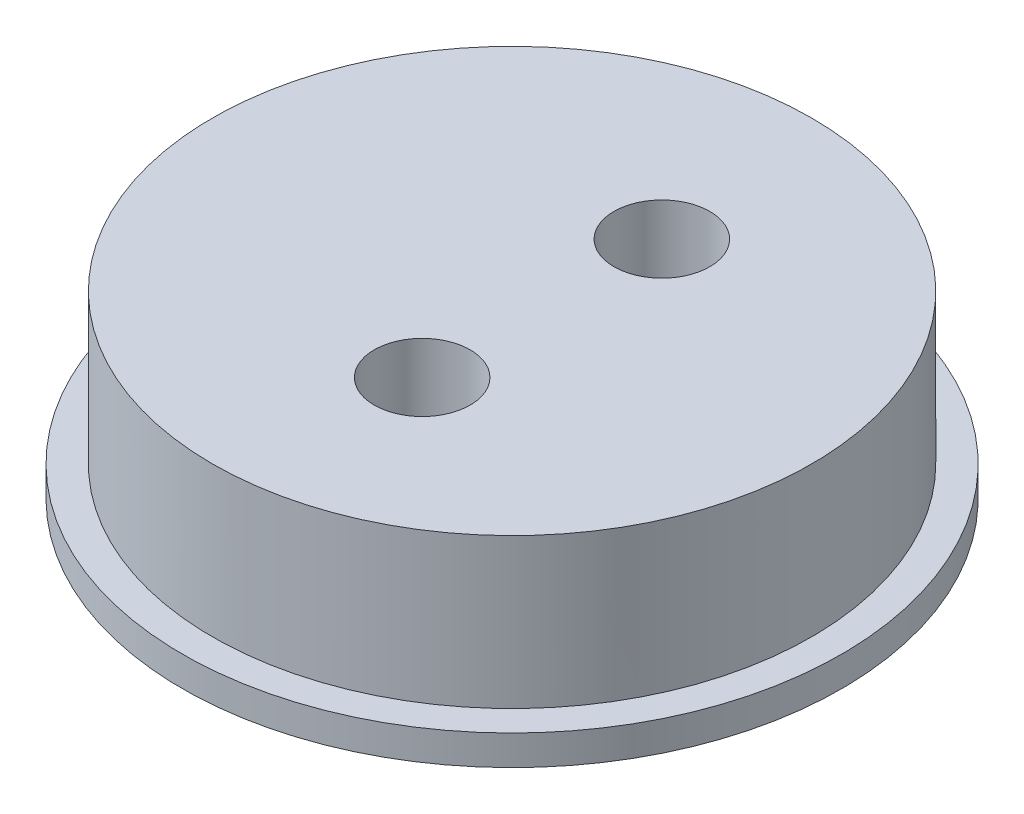
ISO-10303-21;
HEADER;
FILE_DESCRIPTION(('STEP AP214'),'2;1');
FILE_NAME('part.step','',(''),(''),'','','');
FILE_SCHEMA(('AUTOMOTIVE_DESIGN { 1 0 10303 214 1 1 1 1 }'));
ENDSEC;
DATA;
#1=APPLICATION_CONTEXT('core data for automotive mechanical design processes');
#2=APPLICATION_PROTOCOL_DEFINITION('international standard','automotive_design',2000,#1);
#3=PRODUCT_CONTEXT('',#1,'mechanical');
#4=PRODUCT('Part','Part','',(#3));
#5=PRODUCT_RELATED_PRODUCT_CATEGORY('part','',(#4));
#6=PRODUCT_DEFINITION_FORMATION('','',#4);
#7=PRODUCT_DEFINITION_CONTEXT('part definition',#1,'design');
#8=PRODUCT_DEFINITION('design','',#6,#7);
#9=PRODUCT_DEFINITION_SHAPE('','',#8);
#10=(LENGTH_UNIT() NAMED_UNIT(*) SI_UNIT(.MILLI.,.METRE.));
#11=(NAMED_UNIT(*) PLANE_ANGLE_UNIT() SI_UNIT($,.RADIAN.));
#12=(NAMED_UNIT(*) SI_UNIT($,.STERADIAN.) SOLID_ANGLE_UNIT());
#13=UNCERTAINTY_MEASURE_WITH_UNIT(LENGTH_MEASURE(1.E-05),#10,'distance_accuracy_value','');
#14=(GEOMETRIC_REPRESENTATION_CONTEXT(3) GLOBAL_UNCERTAINTY_ASSIGNED_CONTEXT((#13)) GLOBAL_UNIT_ASSIGNED_CONTEXT((#10,
#11,#12)) REPRESENTATION_CONTEXT('',''));
#15=CARTESIAN_POINT('',(0.,0.,0.));
#16=DIRECTION('',(0.,0.,1.));
#17=DIRECTION('',(1.,0.,0.));
#18=AXIS2_PLACEMENT_3D('',#15,#16,#17);
#19=CARTESIAN_POINT('',(-1.,6.,0.));
#20=DIRECTION('',(0.,-1.,0.));
#21=DIRECTION('',(0.,0.,-1.));
#22=AXIS2_PLACEMENT_3D('',#19,#20,#21);
#23=CYLINDRICAL_SURFACE('',#22,10.);
#24=CARTESIAN_POINT('',(-1.,6.,0.));
#25=DIRECTION('',(0.,1.,0.));
#26=DIRECTION('',(0.,0.,1.));
#27=AXIS2_PLACEMENT_3D('',#24,#25,#26);
#28=CIRCLE('',#27,10.);
#29=CARTESIAN_POINT('',(-1.,6.,10.));
#30=VERTEX_POINT('',#29);
#31=EDGE_CURVE('E37',#30,#30,#28,.T.);
#32=ORIENTED_EDGE('',*,*,#31,.F.);
#33=EDGE_LOOP('',(#32));
#34=FACE_BOUND('',#33,.T.);
#35=CARTESIAN_POINT('',(-1.,1.,0.));
#36=DIRECTION('',(0.,-1.,0.));
#37=DIRECTION('',(0.,0.,-1.));
#38=AXIS2_PLACEMENT_3D('',#35,#36,#37);
#39=CIRCLE('',#38,10.);
#40=CARTESIAN_POINT('',(-1.,1.,-10.));
#41=VERTEX_POINT('',#40);
#42=EDGE_CURVE('E10',#41,#41,#39,.T.);
#43=ORIENTED_EDGE('',*,*,#42,.F.);
#44=EDGE_LOOP('',(#43));
#45=FACE_BOUND('',#44,.T.);
#46=ADVANCED_FACE('F31',(#34,#45),#23,.T.);
#47=CARTESIAN_POINT('',(-1.,6.,0.));
#48=DIRECTION('',(0.,1.,0.));
#49=DIRECTION('',(0.,0.,1.));
#50=AXIS2_PLACEMENT_3D('',#47,#48,#49);
#51=PLANE('',#50);
#52=CARTESIAN_POINT('',(0.,6.,-4.));
#53=DIRECTION('',(0.,1.,0.));
#54=DIRECTION('',(0.,0.,1.));
#55=AXIS2_PLACEMENT_3D('',#52,#53,#54);
#56=CIRCLE('',#55,1.6);
#57=CARTESIAN_POINT('',(0.,6.,-2.4));
#58=VERTEX_POINT('',#57);
#59=EDGE_CURVE('E57',#58,#58,#56,.T.);
#60=ORIENTED_EDGE('',*,*,#59,.F.);
#61=EDGE_LOOP('',(#60));
#62=FACE_BOUND('',#61,.T.);
#63=CARTESIAN_POINT('',(0.,6.,4.));
#64=DIRECTION('',(0.,1.,0.));
#65=DIRECTION('',(0.,0.,1.));
#66=AXIS2_PLACEMENT_3D('',#63,#64,#65);
#67=CIRCLE('',#66,1.6);
#68=CARTESIAN_POINT('',(0.,6.,5.6));
#69=VERTEX_POINT('',#68);
#70=EDGE_CURVE('E51',#69,#69,#67,.T.);
#71=ORIENTED_EDGE('',*,*,#70,.F.);
#72=EDGE_LOOP('',(#71));
#73=FACE_BOUND('',#72,.T.);
#74=ORIENTED_EDGE('',*,*,#31,.T.);
#75=EDGE_LOOP('',(#74));
#76=FACE_BOUND('',#75,.T.);
#77=ADVANCED_FACE('F73',(#62,#73,#76),#51,.T.);
#78=CARTESIAN_POINT('',(-1.,1.,0.));
#79=DIRECTION('',(0.,-1.,0.));
#80=DIRECTION('',(0.,0.,-1.));
#81=AXIS2_PLACEMENT_3D('',#78,#79,#80);
#82=CYLINDRICAL_SURFACE('',#81,11.);
#83=CARTESIAN_POINT('',(-1.,1.,0.));
#84=DIRECTION('',(0.,-1.,0.));
#85=DIRECTION('',(0.,0.,-1.));
#86=AXIS2_PLACEMENT_3D('',#83,#84,#85);
#87=CIRCLE('',#86,11.);
#88=CARTESIAN_POINT('',(-1.,1.,-11.));
#89=VERTEX_POINT('',#88);
#90=EDGE_CURVE('E41',#89,#89,#87,.T.);
#91=ORIENTED_EDGE('',*,*,#90,.T.);
#92=EDGE_LOOP('',(#91));
#93=FACE_BOUND('',#92,.T.);
#94=CARTESIAN_POINT('',(-1.,0.,0.));
#95=DIRECTION('',(0.,-1.,0.));
#96=DIRECTION('',(0.,0.,-1.));
#97=AXIS2_PLACEMENT_3D('',#94,#95,#96);
#98=CIRCLE('',#97,11.);
#99=CARTESIAN_POINT('',(-1.,0.,-11.));
#100=VERTEX_POINT('',#99);
#101=EDGE_CURVE('E45',#100,#100,#98,.T.);
#102=ORIENTED_EDGE('',*,*,#101,.F.);
#103=EDGE_LOOP('',(#102));
#104=FACE_BOUND('',#103,.T.);
#105=ADVANCED_FACE('F76',(#93,#104),#82,.T.);
#106=CARTESIAN_POINT('',(-1.,1.,0.));
#107=DIRECTION('',(0.,-1.,0.));
#108=DIRECTION('',(0.,0.,-1.));
#109=AXIS2_PLACEMENT_3D('',#106,#107,#108);
#110=PLANE('',#109);
#111=ORIENTED_EDGE('',*,*,#42,.T.);
#112=EDGE_LOOP('',(#111));
#113=FACE_BOUND('',#112,.T.);
#114=ORIENTED_EDGE('',*,*,#90,.F.);
#115=EDGE_LOOP('',(#114));
#116=FACE_BOUND('',#115,.T.);
#117=ADVANCED_FACE('F86',(#113,#116),#110,.F.);
#118=CARTESIAN_POINT('',(-1.,0.,0.));
#119=DIRECTION('',(0.,1.,0.));
#120=DIRECTION('',(0.,0.,1.));
#121=AXIS2_PLACEMENT_3D('',#118,#119,#120);
#122=PLANE('',#121);
#123=CARTESIAN_POINT('',(0.,0.,-4.));
#124=DIRECTION('',(0.,1.,0.));
#125=DIRECTION('',(0.,0.,1.));
#126=AXIS2_PLACEMENT_3D('',#123,#124,#125);
#127=CIRCLE('',#126,1.6);
#128=CARTESIAN_POINT('',(0.,0.,-2.4));
#129=VERTEX_POINT('',#128);
#130=EDGE_CURVE('E49',#129,#129,#127,.T.);
#131=ORIENTED_EDGE('',*,*,#130,.T.);
#132=EDGE_LOOP('',(#131));
#133=FACE_BOUND('',#132,.T.);
#134=CARTESIAN_POINT('',(0.,0.,4.));
#135=DIRECTION('',(0.,1.,0.));
#136=DIRECTION('',(0.,0.,1.));
#137=AXIS2_PLACEMENT_3D('',#134,#135,#136);
#138=CIRCLE('',#137,1.6);
#139=CARTESIAN_POINT('',(0.,0.,5.6));
#140=VERTEX_POINT('',#139);
#141=EDGE_CURVE('E54',#140,#140,#138,.T.);
#142=ORIENTED_EDGE('',*,*,#141,.T.);
#143=EDGE_LOOP('',(#142));
#144=FACE_BOUND('',#143,.T.);
#145=ORIENTED_EDGE('',*,*,#101,.T.);
#146=EDGE_LOOP('',(#145));
#147=FACE_BOUND('',#146,.T.);
#148=ADVANCED_FACE('F63',(#133,#144,#147),#122,.F.);
#149=CARTESIAN_POINT('',(0.,0.,4.));
#150=DIRECTION('',(0.,1.,0.));
#151=DIRECTION('',(0.,0.,1.));
#152=AXIS2_PLACEMENT_3D('',#149,#150,#151);
#153=CYLINDRICAL_SURFACE('',#152,1.6);
#154=ORIENTED_EDGE('',*,*,#141,.F.);
#155=EDGE_LOOP('',(#154));
#156=FACE_BOUND('',#155,.T.);
#157=ORIENTED_EDGE('',*,*,#70,.T.);
#158=EDGE_LOOP('',(#157));
#159=FACE_BOUND('',#158,.T.);
#160=ADVANCED_FACE('F69',(#156,#159),#153,.F.);
#161=CARTESIAN_POINT('',(0.,0.,-4.));
#162=DIRECTION('',(0.,1.,0.));
#163=DIRECTION('',(0.,0.,1.));
#164=AXIS2_PLACEMENT_3D('',#161,#162,#163);
#165=CYLINDRICAL_SURFACE('',#164,1.6);
#166=ORIENTED_EDGE('',*,*,#130,.F.);
#167=EDGE_LOOP('',(#166));
#168=FACE_BOUND('',#167,.T.);
#169=ORIENTED_EDGE('',*,*,#59,.T.);
#170=EDGE_LOOP('',(#169));
#171=FACE_BOUND('',#170,.T.);
#172=ADVANCED_FACE('F66',(#168,#171),#165,.F.);
#173=CLOSED_SHELL('',(#46,#77,#105,#117,#148,#160,#172));
#174=MANIFOLD_SOLID_BREP('B2',#173);
#175=ADVANCED_BREP_SHAPE_REPRESENTATION('',(#18,#174),#14);
#176=SHAPE_DEFINITION_REPRESENTATION(#9,#175);
ENDSEC;
END-ISO-10303-21;
